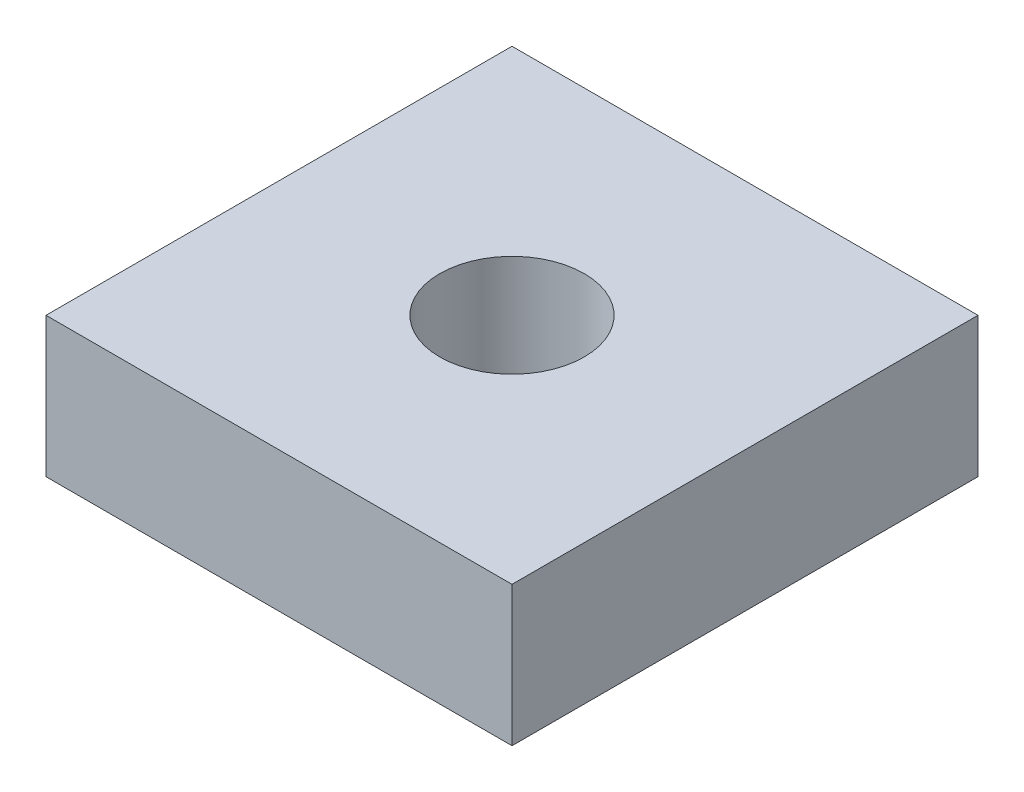
ISO-10303-21;
HEADER;
FILE_DESCRIPTION(('STEP AP214'),'2;1');
FILE_NAME('part.step','',(''),(''),'','','');
FILE_SCHEMA(('AUTOMOTIVE_DESIGN { 1 0 10303 214 1 1 1 1 }'));
ENDSEC;
DATA;
#1=APPLICATION_CONTEXT('core data for automotive mechanical design processes');
#2=APPLICATION_PROTOCOL_DEFINITION('international standard','automotive_design',2000,#1);
#3=PRODUCT_CONTEXT('',#1,'mechanical');
#4=PRODUCT('Part','Part','',(#3));
#5=PRODUCT_RELATED_PRODUCT_CATEGORY('part','',(#4));
#6=PRODUCT_DEFINITION_FORMATION('','',#4);
#7=PRODUCT_DEFINITION_CONTEXT('part definition',#1,'design');
#8=PRODUCT_DEFINITION('design','',#6,#7);
#9=PRODUCT_DEFINITION_SHAPE('','',#8);
#10=(LENGTH_UNIT() NAMED_UNIT(*) SI_UNIT(.MILLI.,.METRE.));
#11=(NAMED_UNIT(*) PLANE_ANGLE_UNIT() SI_UNIT($,.RADIAN.));
#12=(NAMED_UNIT(*) SI_UNIT($,.STERADIAN.) SOLID_ANGLE_UNIT());
#13=UNCERTAINTY_MEASURE_WITH_UNIT(LENGTH_MEASURE(1.E-05),#10,'distance_accuracy_value','');
#14=(GEOMETRIC_REPRESENTATION_CONTEXT(3) GLOBAL_UNCERTAINTY_ASSIGNED_CONTEXT((#13)) GLOBAL_UNIT_ASSIGNED_CONTEXT((#10,
#11,#12)) REPRESENTATION_CONTEXT('',''));
#15=CARTESIAN_POINT('',(0.,0.,0.));
#16=DIRECTION('',(0.,0.,1.));
#17=DIRECTION('',(1.,0.,0.));
#18=AXIS2_PLACEMENT_3D('',#15,#16,#17);
#19=CARTESIAN_POINT('',(0.,3.,0.));
#20=DIRECTION('',(0.,-1.,0.));
#21=DIRECTION('',(0.,0.,-1.));
#22=AXIS2_PLACEMENT_3D('',#19,#20,#21);
#23=PLANE('',#22);
#24=DIRECTION('',(0.,0.,-1.));
#25=VECTOR('',#24,1.);
#26=CARTESIAN_POINT('',(5.,3.,5.));
#27=LINE('',#26,#25);
#28=CARTESIAN_POINT('',(5.,3.,5.));
#29=VERTEX_POINT('',#28);
#30=CARTESIAN_POINT('',(5.,3.,-5.));
#31=VERTEX_POINT('',#30);
#32=EDGE_CURVE('E85',#29,#31,#27,.T.);
#33=ORIENTED_EDGE('',*,*,#32,.T.);
#34=DIRECTION('',(-1.,0.,0.));
#35=VECTOR('',#34,1.);
#36=CARTESIAN_POINT('',(-5.,3.,-5.));
#37=LINE('',#36,#35);
#38=CARTESIAN_POINT('',(-5.,3.,-5.));
#39=VERTEX_POINT('',#38);
#40=EDGE_CURVE('E80',#31,#39,#37,.T.);
#41=ORIENTED_EDGE('',*,*,#40,.T.);
#42=DIRECTION('',(0.,0.,1.));
#43=VECTOR('',#42,1.);
#44=CARTESIAN_POINT('',(-5.,3.,5.));
#45=LINE('',#44,#43);
#46=CARTESIAN_POINT('',(-5.,3.,5.));
#47=VERTEX_POINT('',#46);
#48=EDGE_CURVE('E83',#39,#47,#45,.T.);
#49=ORIENTED_EDGE('',*,*,#48,.T.);
#50=DIRECTION('',(1.,0.,0.));
#51=VECTOR('',#50,1.);
#52=CARTESIAN_POINT('',(-5.,3.,5.));
#53=LINE('',#52,#51);
#54=EDGE_CURVE('E50',#47,#29,#53,.T.);
#55=ORIENTED_EDGE('',*,*,#54,.T.);
#56=EDGE_LOOP('',(#33,#41,#49,#55));
#57=FACE_BOUND('',#56,.T.);
#58=CARTESIAN_POINT('',(0.,3.,0.));
#59=DIRECTION('',(0.,1.,0.));
#60=DIRECTION('',(0.,0.,1.));
#61=AXIS2_PLACEMENT_3D('',#58,#59,#60);
#62=CIRCLE('',#61,1.55);
#63=CARTESIAN_POINT('',(0.,3.,1.55));
#64=VERTEX_POINT('',#63);
#65=EDGE_CURVE('E100',#64,#64,#62,.T.);
#66=ORIENTED_EDGE('',*,*,#65,.F.);
#67=EDGE_LOOP('',(#66));
#68=FACE_BOUND('',#67,.T.);
#69=ADVANCED_FACE('F33',(#57,#68),#23,.F.);
#70=CARTESIAN_POINT('',(0.,0.,0.));
#71=DIRECTION('',(0.,-1.,0.));
#72=DIRECTION('',(0.,0.,-1.));
#73=AXIS2_PLACEMENT_3D('',#70,#71,#72);
#74=PLANE('',#73);
#75=DIRECTION('',(0.,0.,-1.));
#76=VECTOR('',#75,1.);
#77=CARTESIAN_POINT('',(5.,0.,5.));
#78=LINE('',#77,#76);
#79=CARTESIAN_POINT('',(5.,0.,5.));
#80=VERTEX_POINT('',#79);
#81=CARTESIAN_POINT('',(5.,0.,-5.));
#82=VERTEX_POINT('',#81);
#83=EDGE_CURVE('E97',#80,#82,#78,.T.);
#84=ORIENTED_EDGE('',*,*,#83,.F.);
#85=DIRECTION('',(1.,0.,0.));
#86=VECTOR('',#85,1.);
#87=CARTESIAN_POINT('',(-5.,0.,5.));
#88=LINE('',#87,#86);
#89=CARTESIAN_POINT('',(-5.,0.,5.));
#90=VERTEX_POINT('',#89);
#91=EDGE_CURVE('E73',#90,#80,#88,.T.);
#92=ORIENTED_EDGE('',*,*,#91,.F.);
#93=DIRECTION('',(0.,0.,1.));
#94=VECTOR('',#93,1.);
#95=CARTESIAN_POINT('',(-5.,0.,5.));
#96=LINE('',#95,#94);
#97=CARTESIAN_POINT('',(-5.,0.,-5.));
#98=VERTEX_POINT('',#97);
#99=EDGE_CURVE('E67',#98,#90,#96,.T.);
#100=ORIENTED_EDGE('',*,*,#99,.F.);
#101=DIRECTION('',(-1.,0.,0.));
#102=VECTOR('',#101,1.);
#103=CARTESIAN_POINT('',(-5.,0.,-5.));
#104=LINE('',#103,#102);
#105=EDGE_CURVE('E89',#82,#98,#104,.T.);
#106=ORIENTED_EDGE('',*,*,#105,.F.);
#107=EDGE_LOOP('',(#84,#92,#100,#106));
#108=FACE_BOUND('',#107,.T.);
#109=CARTESIAN_POINT('',(0.,0.,0.));
#110=DIRECTION('',(0.,1.,0.));
#111=DIRECTION('',(0.,0.,1.));
#112=AXIS2_PLACEMENT_3D('',#109,#110,#111);
#113=CIRCLE('',#112,1.55);
#114=CARTESIAN_POINT('',(0.,0.,1.55));
#115=VERTEX_POINT('',#114);
#116=EDGE_CURVE('E112',#115,#115,#113,.T.);
#117=ORIENTED_EDGE('',*,*,#116,.T.);
#118=EDGE_LOOP('',(#117));
#119=FACE_BOUND('',#118,.T.);
#120=ADVANCED_FACE('F108',(#108,#119),#74,.T.);
#121=CARTESIAN_POINT('',(5.,3.,5.));
#122=DIRECTION('',(-1.,0.,0.));
#123=DIRECTION('',(0.,0.,1.));
#124=AXIS2_PLACEMENT_3D('',#121,#122,#123);
#125=PLANE('',#124);
#126=ORIENTED_EDGE('',*,*,#83,.T.);
#127=DIRECTION('',(0.,-1.,0.));
#128=VECTOR('',#127,1.);
#129=CARTESIAN_POINT('',(5.,3.,-5.));
#130=LINE('',#129,#128);
#131=EDGE_CURVE('E11',#31,#82,#130,.T.);
#132=ORIENTED_EDGE('',*,*,#131,.F.);
#133=ORIENTED_EDGE('',*,*,#32,.F.);
#134=DIRECTION('',(0.,-1.,0.));
#135=VECTOR('',#134,1.);
#136=CARTESIAN_POINT('',(5.,3.,5.));
#137=LINE('',#136,#135);
#138=EDGE_CURVE('E93',#29,#80,#137,.T.);
#139=ORIENTED_EDGE('',*,*,#138,.T.);
#140=EDGE_LOOP('',(#126,#132,#133,#139));
#141=FACE_BOUND('',#140,.T.);
#142=ADVANCED_FACE('F35',(#141),#125,.F.);
#143=CARTESIAN_POINT('',(-5.,3.,-5.));
#144=DIRECTION('',(0.,0.,1.));
#145=DIRECTION('',(1.,0.,0.));
#146=AXIS2_PLACEMENT_3D('',#143,#144,#145);
#147=PLANE('',#146);
#148=ORIENTED_EDGE('',*,*,#105,.T.);
#149=DIRECTION('',(0.,-1.,0.));
#150=VECTOR('',#149,1.);
#151=CARTESIAN_POINT('',(-5.,3.,-5.));
#152=LINE('',#151,#150);
#153=EDGE_CURVE('E42',#39,#98,#152,.T.);
#154=ORIENTED_EDGE('',*,*,#153,.F.);
#155=ORIENTED_EDGE('',*,*,#40,.F.);
#156=ORIENTED_EDGE('',*,*,#131,.T.);
#157=EDGE_LOOP('',(#148,#154,#155,#156));
#158=FACE_BOUND('',#157,.T.);
#159=ADVANCED_FACE('F88',(#158),#147,.F.);
#160=CARTESIAN_POINT('',(-5.,3.,5.));
#161=DIRECTION('',(1.,0.,0.));
#162=DIRECTION('',(0.,0.,-1.));
#163=AXIS2_PLACEMENT_3D('',#160,#161,#162);
#164=PLANE('',#163);
#165=ORIENTED_EDGE('',*,*,#99,.T.);
#166=DIRECTION('',(0.,-1.,0.));
#167=VECTOR('',#166,1.);
#168=CARTESIAN_POINT('',(-5.,3.,5.));
#169=LINE('',#168,#167);
#170=EDGE_CURVE('E90',#47,#90,#169,.T.);
#171=ORIENTED_EDGE('',*,*,#170,.F.);
#172=ORIENTED_EDGE('',*,*,#48,.F.);
#173=ORIENTED_EDGE('',*,*,#153,.T.);
#174=EDGE_LOOP('',(#165,#171,#172,#173));
#175=FACE_BOUND('',#174,.T.);
#176=ADVANCED_FACE('F91',(#175),#164,.F.);
#177=CARTESIAN_POINT('',(-5.,3.,5.));
#178=DIRECTION('',(0.,0.,-1.));
#179=DIRECTION('',(-1.,0.,0.));
#180=AXIS2_PLACEMENT_3D('',#177,#178,#179);
#181=PLANE('',#180);
#182=ORIENTED_EDGE('',*,*,#91,.T.);
#183=ORIENTED_EDGE('',*,*,#138,.F.);
#184=ORIENTED_EDGE('',*,*,#54,.F.);
#185=ORIENTED_EDGE('',*,*,#170,.T.);
#186=EDGE_LOOP('',(#182,#183,#184,#185));
#187=FACE_BOUND('',#186,.T.);
#188=ADVANCED_FACE('F105',(#187),#181,.F.);
#189=CARTESIAN_POINT('',(0.,3.,0.));
#190=DIRECTION('',(0.,-1.,0.));
#191=DIRECTION('',(0.,0.,-1.));
#192=AXIS2_PLACEMENT_3D('',#189,#190,#191);
#193=CYLINDRICAL_SURFACE('',#192,1.55);
#194=ORIENTED_EDGE('',*,*,#65,.T.);
#195=EDGE_LOOP('',(#194));
#196=FACE_BOUND('',#195,.T.);
#197=ORIENTED_EDGE('',*,*,#116,.F.);
#198=EDGE_LOOP('',(#197));
#199=FACE_BOUND('',#198,.T.);
#200=ADVANCED_FACE('F118',(#196,#199),#193,.F.);
#201=CLOSED_SHELL('',(#69,#120,#142,#159,#176,#188,#200));
#202=MANIFOLD_SOLID_BREP('B2',#201);
#203=ADVANCED_BREP_SHAPE_REPRESENTATION('',(#18,#202),#14);
#204=SHAPE_DEFINITION_REPRESENTATION(#9,#203);
ENDSEC;
END-ISO-10303-21;
